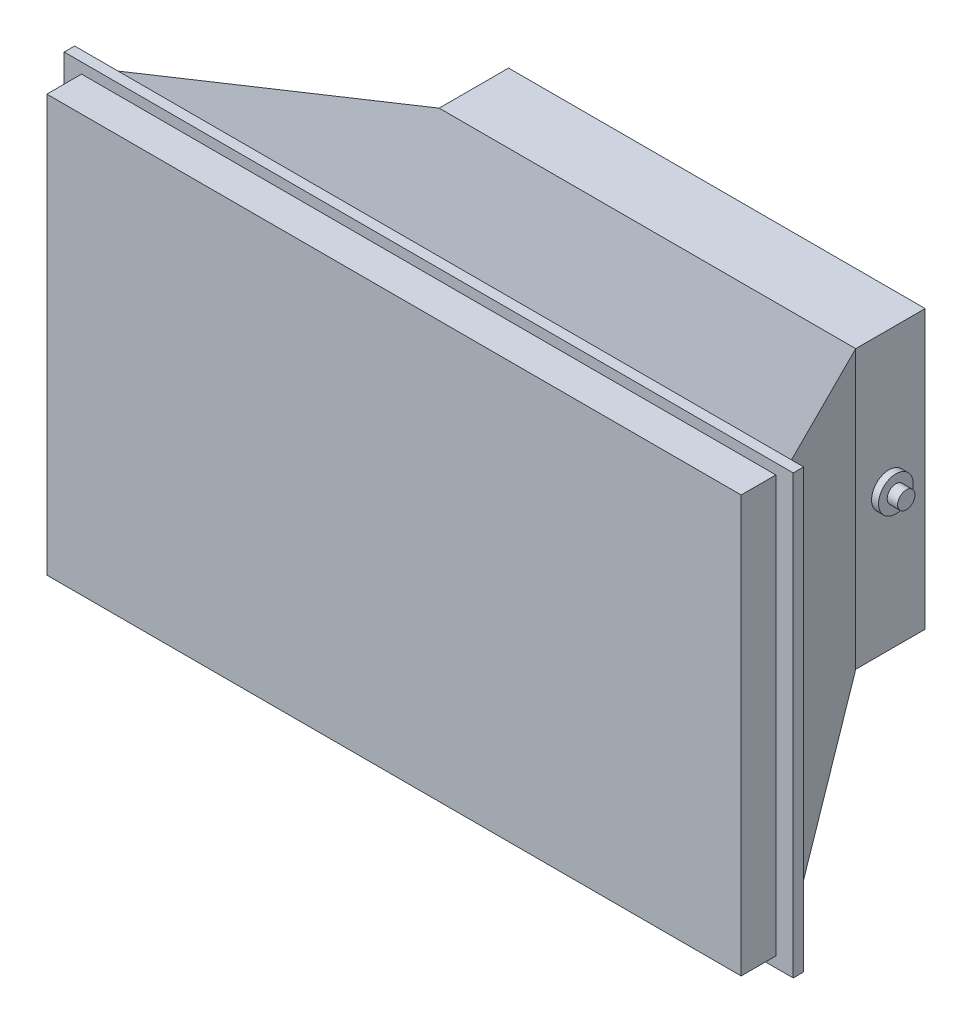
ISO-10303-21;
HEADER;
FILE_DESCRIPTION(('STEP AP214'),'2;1');
FILE_NAME('part.step','',(''),(''),'','','');
FILE_SCHEMA(('AUTOMOTIVE_DESIGN { 1 0 10303 214 1 1 1 1 }'));
ENDSEC;
DATA;
#1=APPLICATION_CONTEXT('core data for automotive mechanical design processes');
#2=APPLICATION_PROTOCOL_DEFINITION('international standard','automotive_design',2000,#1);
#3=PRODUCT_CONTEXT('',#1,'mechanical');
#4=PRODUCT('Part','Part','',(#3));
#5=PRODUCT_RELATED_PRODUCT_CATEGORY('part','',(#4));
#6=PRODUCT_DEFINITION_FORMATION('','',#4);
#7=PRODUCT_DEFINITION_CONTEXT('part definition',#1,'design');
#8=PRODUCT_DEFINITION('design','',#6,#7);
#9=PRODUCT_DEFINITION_SHAPE('','',#8);
#10=(LENGTH_UNIT() NAMED_UNIT(*) SI_UNIT(.MILLI.,.METRE.));
#11=(NAMED_UNIT(*) PLANE_ANGLE_UNIT() SI_UNIT($,.RADIAN.));
#12=(NAMED_UNIT(*) SI_UNIT($,.STERADIAN.) SOLID_ANGLE_UNIT());
#13=UNCERTAINTY_MEASURE_WITH_UNIT(LENGTH_MEASURE(1.E-05),#10,'distance_accuracy_value','');
#14=(GEOMETRIC_REPRESENTATION_CONTEXT(3) GLOBAL_UNCERTAINTY_ASSIGNED_CONTEXT((#13)) GLOBAL_UNIT_ASSIGNED_CONTEXT((#10,
#11,#12)) REPRESENTATION_CONTEXT('',''));
#15=CARTESIAN_POINT('',(0.,0.,0.));
#16=DIRECTION('',(0.,0.,1.));
#17=DIRECTION('',(1.,0.,0.));
#18=AXIS2_PLACEMENT_3D('',#15,#16,#17);
#19=CARTESIAN_POINT('',(0.,0.,-13.));
#20=DIRECTION('',(0.,0.,-1.));
#21=DIRECTION('',(-1.,0.,0.));
#22=AXIS2_PLACEMENT_3D('',#19,#20,#21);
#23=PLANE('',#22);
#24=DIRECTION('',(0.,-1.,0.));
#25=VECTOR('',#24,1.);
#26=CARTESIAN_POINT('',(105.,63.,-13.));
#27=LINE('',#26,#25);
#28=CARTESIAN_POINT('',(105.,63.,-13.));
#29=VERTEX_POINT('',#28);
#30=CARTESIAN_POINT('',(105.,-63.,-13.));
#31=VERTEX_POINT('',#30);
#32=EDGE_CURVE('E331',#29,#31,#27,.T.);
#33=ORIENTED_EDGE('',*,*,#32,.T.);
#34=DIRECTION('',(-1.,0.,0.));
#35=VECTOR('',#34,1.);
#36=CARTESIAN_POINT('',(105.,-63.,-13.));
#37=LINE('',#36,#35);
#38=CARTESIAN_POINT('',(-105.,-63.,-13.));
#39=VERTEX_POINT('',#38);
#40=EDGE_CURVE('E346',#31,#39,#37,.T.);
#41=ORIENTED_EDGE('',*,*,#40,.T.);
#42=DIRECTION('',(0.,1.,0.));
#43=VECTOR('',#42,1.);
#44=CARTESIAN_POINT('',(-105.,63.,-13.));
#45=LINE('',#44,#43);
#46=CARTESIAN_POINT('',(-105.,63.,-13.));
#47=VERTEX_POINT('',#46);
#48=EDGE_CURVE('E343',#39,#47,#45,.T.);
#49=ORIENTED_EDGE('',*,*,#48,.T.);
#50=DIRECTION('',(1.,0.,0.));
#51=VECTOR('',#50,1.);
#52=CARTESIAN_POINT('',(105.,63.,-13.));
#53=LINE('',#52,#51);
#54=EDGE_CURVE('E327',#47,#29,#53,.T.);
#55=ORIENTED_EDGE('',*,*,#54,.T.);
#56=EDGE_LOOP('',(#33,#41,#49,#55));
#57=FACE_BOUND('',#56,.T.);
#58=DIRECTION('',(-1.,0.,0.));
#59=VECTOR('',#58,1.);
#60=CARTESIAN_POINT('',(100.,-60.,-13.));
#61=LINE('',#60,#59);
#62=CARTESIAN_POINT('',(100.,-60.,-13.));
#63=VERTEX_POINT('',#62);
#64=CARTESIAN_POINT('',(-100.,-60.,-13.));
#65=VERTEX_POINT('',#64);
#66=EDGE_CURVE('E124',#63,#65,#61,.T.);
#67=ORIENTED_EDGE('',*,*,#66,.F.);
#68=DIRECTION('',(0.,-1.,0.));
#69=VECTOR('',#68,1.);
#70=CARTESIAN_POINT('',(100.,60.,-13.));
#71=LINE('',#70,#69);
#72=CARTESIAN_POINT('',(100.,60.,-13.));
#73=VERTEX_POINT('',#72);
#74=EDGE_CURVE('E127',#73,#63,#71,.T.);
#75=ORIENTED_EDGE('',*,*,#74,.F.);
#76=DIRECTION('',(1.,0.,0.));
#77=VECTOR('',#76,1.);
#78=CARTESIAN_POINT('',(100.,60.,-13.));
#79=LINE('',#78,#77);
#80=CARTESIAN_POINT('',(-100.,60.,-13.));
#81=VERTEX_POINT('',#80);
#82=EDGE_CURVE('E130',#81,#73,#79,.T.);
#83=ORIENTED_EDGE('',*,*,#82,.F.);
#84=DIRECTION('',(0.,1.,0.));
#85=VECTOR('',#84,1.);
#86=CARTESIAN_POINT('',(-100.,60.,-13.));
#87=LINE('',#86,#85);
#88=EDGE_CURVE('E126',#65,#81,#87,.T.);
#89=ORIENTED_EDGE('',*,*,#88,.F.);
#90=EDGE_LOOP('',(#67,#75,#83,#89));
#91=FACE_BOUND('',#90,.T.);
#92=ADVANCED_FACE('F47',(#57,#91),#23,.T.);
#93=CARTESIAN_POINT('',(-100.,60.,-10.));
#94=DIRECTION('',(-1.,0.,0.));
#95=DIRECTION('',(0.,-1.,0.));
#96=AXIS2_PLACEMENT_3D('',#93,#94,#95);
#97=PLANE('',#96);
#98=DIRECTION('',(0.,-1.,0.));
#99=VECTOR('',#98,1.);
#100=CARTESIAN_POINT('',(-100.,60.,0.));
#101=LINE('',#100,#99);
#102=CARTESIAN_POINT('',(-100.,60.,0.));
#103=VERTEX_POINT('',#102);
#104=CARTESIAN_POINT('',(-100.,-60.,0.));
#105=VERTEX_POINT('',#104);
#106=EDGE_CURVE('E115',#103,#105,#101,.T.);
#107=ORIENTED_EDGE('',*,*,#106,.F.);
#108=DIRECTION('',(0.,0.,1.));
#109=VECTOR('',#108,1.);
#110=CARTESIAN_POINT('',(-100.,60.,-10.));
#111=LINE('',#110,#109);
#112=CARTESIAN_POINT('',(-100.,60.,-10.));
#113=VERTEX_POINT('',#112);
#114=EDGE_CURVE('E97',#113,#103,#111,.T.);
#115=ORIENTED_EDGE('',*,*,#114,.F.);
#116=DIRECTION('',(0.,-1.,0.));
#117=VECTOR('',#116,1.);
#118=CARTESIAN_POINT('',(-100.,60.,-10.));
#119=LINE('',#118,#117);
#120=CARTESIAN_POINT('',(-100.,-60.,-10.));
#121=VERTEX_POINT('',#120);
#122=EDGE_CURVE('E102',#113,#121,#119,.T.);
#123=ORIENTED_EDGE('',*,*,#122,.T.);
#124=DIRECTION('',(0.,0.,1.));
#125=VECTOR('',#124,1.);
#126=CARTESIAN_POINT('',(-100.,-60.,-10.));
#127=LINE('',#126,#125);
#128=EDGE_CURVE('E121',#121,#105,#127,.T.);
#129=ORIENTED_EDGE('',*,*,#128,.T.);
#130=EDGE_LOOP('',(#107,#115,#123,#129));
#131=FACE_BOUND('',#130,.T.);
#132=ADVANCED_FACE('F49',(#131),#97,.T.);
#133=CARTESIAN_POINT('',(-100.,60.,-10.));
#134=DIRECTION('',(0.,-1.,0.));
#135=DIRECTION('',(1.,0.,0.));
#136=AXIS2_PLACEMENT_3D('',#133,#134,#135);
#137=PLANE('',#136);
#138=DIRECTION('',(1.,0.,0.));
#139=VECTOR('',#138,1.);
#140=CARTESIAN_POINT('',(-100.,60.,0.));
#141=LINE('',#140,#139);
#142=CARTESIAN_POINT('',(100.,60.,0.));
#143=VERTEX_POINT('',#142);
#144=EDGE_CURVE('E90',#103,#143,#141,.T.);
#145=ORIENTED_EDGE('',*,*,#144,.T.);
#146=DIRECTION('',(0.,0.,1.));
#147=VECTOR('',#146,1.);
#148=CARTESIAN_POINT('',(100.,60.,-10.));
#149=LINE('',#148,#147);
#150=CARTESIAN_POINT('',(100.,60.,-10.));
#151=VERTEX_POINT('',#150);
#152=EDGE_CURVE('E95',#151,#143,#149,.T.);
#153=ORIENTED_EDGE('',*,*,#152,.F.);
#154=DIRECTION('',(1.,0.,0.));
#155=VECTOR('',#154,1.);
#156=CARTESIAN_POINT('',(-100.,60.,-10.));
#157=LINE('',#156,#155);
#158=EDGE_CURVE('E123',#113,#151,#157,.T.);
#159=ORIENTED_EDGE('',*,*,#158,.F.);
#160=ORIENTED_EDGE('',*,*,#114,.T.);
#161=EDGE_LOOP('',(#145,#153,#159,#160));
#162=FACE_BOUND('',#161,.T.);
#163=ADVANCED_FACE('F92',(#162),#137,.F.);
#164=CARTESIAN_POINT('',(100.,60.,-10.));
#165=DIRECTION('',(-1.,0.,0.));
#166=DIRECTION('',(0.,-1.,0.));
#167=AXIS2_PLACEMENT_3D('',#164,#165,#166);
#168=PLANE('',#167);
#169=DIRECTION('',(0.,-1.,0.));
#170=VECTOR('',#169,1.);
#171=CARTESIAN_POINT('',(100.,60.,0.));
#172=LINE('',#171,#170);
#173=CARTESIAN_POINT('',(100.,-60.,0.));
#174=VERTEX_POINT('',#173);
#175=EDGE_CURVE('E103',#143,#174,#172,.T.);
#176=ORIENTED_EDGE('',*,*,#175,.T.);
#177=DIRECTION('',(0.,0.,1.));
#178=VECTOR('',#177,1.);
#179=CARTESIAN_POINT('',(100.,-60.,-10.));
#180=LINE('',#179,#178);
#181=CARTESIAN_POINT('',(100.,-60.,-10.));
#182=VERTEX_POINT('',#181);
#183=EDGE_CURVE('E109',#182,#174,#180,.T.);
#184=ORIENTED_EDGE('',*,*,#183,.F.);
#185=DIRECTION('',(0.,-1.,0.));
#186=VECTOR('',#185,1.);
#187=CARTESIAN_POINT('',(100.,60.,-10.));
#188=LINE('',#187,#186);
#189=EDGE_CURVE('E72',#151,#182,#188,.T.);
#190=ORIENTED_EDGE('',*,*,#189,.F.);
#191=ORIENTED_EDGE('',*,*,#152,.T.);
#192=EDGE_LOOP('',(#176,#184,#190,#191));
#193=FACE_BOUND('',#192,.T.);
#194=ADVANCED_FACE('F107',(#193),#168,.F.);
#195=CARTESIAN_POINT('',(-100.,-60.,-10.));
#196=DIRECTION('',(0.,-1.,0.));
#197=DIRECTION('',(1.,0.,0.));
#198=AXIS2_PLACEMENT_3D('',#195,#196,#197);
#199=PLANE('',#198);
#200=DIRECTION('',(1.,0.,0.));
#201=VECTOR('',#200,1.);
#202=CARTESIAN_POINT('',(-100.,-60.,0.));
#203=LINE('',#202,#201);
#204=EDGE_CURVE('E113',#105,#174,#203,.T.);
#205=ORIENTED_EDGE('',*,*,#204,.F.);
#206=ORIENTED_EDGE('',*,*,#128,.F.);
#207=DIRECTION('',(1.,0.,0.));
#208=VECTOR('',#207,1.);
#209=CARTESIAN_POINT('',(-100.,-60.,-10.));
#210=LINE('',#209,#208);
#211=EDGE_CURVE('E316',#121,#182,#210,.T.);
#212=ORIENTED_EDGE('',*,*,#211,.T.);
#213=ORIENTED_EDGE('',*,*,#183,.T.);
#214=EDGE_LOOP('',(#205,#206,#212,#213));
#215=FACE_BOUND('',#214,.T.);
#216=ADVANCED_FACE('F296',(#215),#199,.T.);
#217=CARTESIAN_POINT('',(0.,0.,0.));
#218=DIRECTION('',(0.,0.,1.));
#219=DIRECTION('',(1.,0.,0.));
#220=AXIS2_PLACEMENT_3D('',#217,#218,#219);
#221=PLANE('',#220);
#222=ORIENTED_EDGE('',*,*,#106,.T.);
#223=ORIENTED_EDGE('',*,*,#204,.T.);
#224=ORIENTED_EDGE('',*,*,#175,.F.);
#225=ORIENTED_EDGE('',*,*,#144,.F.);
#226=EDGE_LOOP('',(#222,#223,#224,#225));
#227=FACE_BOUND('',#226,.T.);
#228=ADVANCED_FACE('F111',(#227),#221,.T.);
#229=CARTESIAN_POINT('',(105.,63.,-13.));
#230=DIRECTION('',(-1.,0.,0.));
#231=DIRECTION('',(0.,-1.,0.));
#232=AXIS2_PLACEMENT_3D('',#229,#230,#231);
#233=PLANE('',#232);
#234=DIRECTION('',(0.,-1.,0.));
#235=VECTOR('',#234,1.);
#236=CARTESIAN_POINT('',(105.,63.,-10.));
#237=LINE('',#236,#235);
#238=CARTESIAN_POINT('',(105.,63.,-10.));
#239=VERTEX_POINT('',#238);
#240=CARTESIAN_POINT('',(105.,-63.,-10.));
#241=VERTEX_POINT('',#240);
#242=EDGE_CURVE('E338',#239,#241,#237,.T.);
#243=ORIENTED_EDGE('',*,*,#242,.T.);
#244=DIRECTION('',(0.,0.,1.));
#245=VECTOR('',#244,1.);
#246=CARTESIAN_POINT('',(105.,-63.,-13.));
#247=LINE('',#246,#245);
#248=EDGE_CURVE('E309',#31,#241,#247,.T.);
#249=ORIENTED_EDGE('',*,*,#248,.F.);
#250=ORIENTED_EDGE('',*,*,#32,.F.);
#251=DIRECTION('',(0.,0.,1.));
#252=VECTOR('',#251,1.);
#253=CARTESIAN_POINT('',(105.,63.,-13.));
#254=LINE('',#253,#252);
#255=EDGE_CURVE('E324',#29,#239,#254,.T.);
#256=ORIENTED_EDGE('',*,*,#255,.T.);
#257=EDGE_LOOP('',(#243,#249,#250,#256));
#258=FACE_BOUND('',#257,.T.);
#259=ADVANCED_FACE('F289',(#258),#233,.F.);
#260=CARTESIAN_POINT('',(105.,-63.,-13.));
#261=DIRECTION('',(0.,1.,0.));
#262=DIRECTION('',(0.,0.,1.));
#263=AXIS2_PLACEMENT_3D('',#260,#261,#262);
#264=PLANE('',#263);
#265=DIRECTION('',(-1.,0.,0.));
#266=VECTOR('',#265,1.);
#267=CARTESIAN_POINT('',(105.,-63.,-10.));
#268=LINE('',#267,#266);
#269=CARTESIAN_POINT('',(-105.,-63.,-10.));
#270=VERTEX_POINT('',#269);
#271=EDGE_CURVE('E335',#241,#270,#268,.T.);
#272=ORIENTED_EDGE('',*,*,#271,.T.);
#273=DIRECTION('',(0.,0.,1.));
#274=VECTOR('',#273,1.);
#275=CARTESIAN_POINT('',(-105.,-63.,-13.));
#276=LINE('',#275,#274);
#277=EDGE_CURVE('E311',#39,#270,#276,.T.);
#278=ORIENTED_EDGE('',*,*,#277,.F.);
#279=ORIENTED_EDGE('',*,*,#40,.F.);
#280=ORIENTED_EDGE('',*,*,#248,.T.);
#281=EDGE_LOOP('',(#272,#278,#279,#280));
#282=FACE_BOUND('',#281,.T.);
#283=ADVANCED_FACE('F285',(#282),#264,.F.);
#284=CARTESIAN_POINT('',(-105.,63.,-13.));
#285=DIRECTION('',(1.,0.,0.));
#286=DIRECTION('',(0.,1.,0.));
#287=AXIS2_PLACEMENT_3D('',#284,#285,#286);
#288=PLANE('',#287);
#289=DIRECTION('',(0.,1.,0.));
#290=VECTOR('',#289,1.);
#291=CARTESIAN_POINT('',(-105.,63.,-10.));
#292=LINE('',#291,#290);
#293=CARTESIAN_POINT('',(-105.,63.,-10.));
#294=VERTEX_POINT('',#293);
#295=EDGE_CURVE('E332',#270,#294,#292,.T.);
#296=ORIENTED_EDGE('',*,*,#295,.T.);
#297=DIRECTION('',(0.,0.,1.));
#298=VECTOR('',#297,1.);
#299=CARTESIAN_POINT('',(-105.,63.,-13.));
#300=LINE('',#299,#298);
#301=EDGE_CURVE('E321',#47,#294,#300,.T.);
#302=ORIENTED_EDGE('',*,*,#301,.F.);
#303=ORIENTED_EDGE('',*,*,#48,.F.);
#304=ORIENTED_EDGE('',*,*,#277,.T.);
#305=EDGE_LOOP('',(#296,#302,#303,#304));
#306=FACE_BOUND('',#305,.T.);
#307=ADVANCED_FACE('F281',(#306),#288,.F.);
#308=CARTESIAN_POINT('',(105.,63.,-13.));
#309=DIRECTION('',(0.,-1.,0.));
#310=DIRECTION('',(0.,0.,-1.));
#311=AXIS2_PLACEMENT_3D('',#308,#309,#310);
#312=PLANE('',#311);
#313=DIRECTION('',(1.,0.,0.));
#314=VECTOR('',#313,1.);
#315=CARTESIAN_POINT('',(105.,63.,-10.));
#316=LINE('',#315,#314);
#317=EDGE_CURVE('E328',#294,#239,#316,.T.);
#318=ORIENTED_EDGE('',*,*,#317,.T.);
#319=ORIENTED_EDGE('',*,*,#255,.F.);
#320=ORIENTED_EDGE('',*,*,#54,.F.);
#321=ORIENTED_EDGE('',*,*,#301,.T.);
#322=EDGE_LOOP('',(#318,#319,#320,#321));
#323=FACE_BOUND('',#322,.T.);
#324=ADVANCED_FACE('F278',(#323),#312,.F.);
#325=CARTESIAN_POINT('',(0.,0.,-10.));
#326=DIRECTION('',(0.,0.,-1.));
#327=DIRECTION('',(-1.,0.,0.));
#328=AXIS2_PLACEMENT_3D('',#325,#326,#327);
#329=PLANE('',#328);
#330=ORIENTED_EDGE('',*,*,#122,.F.);
#331=ORIENTED_EDGE('',*,*,#158,.T.);
#332=ORIENTED_EDGE('',*,*,#189,.T.);
#333=ORIENTED_EDGE('',*,*,#211,.F.);
#334=EDGE_LOOP('',(#330,#331,#332,#333));
#335=FACE_BOUND('',#334,.T.);
#336=ORIENTED_EDGE('',*,*,#242,.F.);
#337=ORIENTED_EDGE('',*,*,#317,.F.);
#338=ORIENTED_EDGE('',*,*,#295,.F.);
#339=ORIENTED_EDGE('',*,*,#271,.F.);
#340=EDGE_LOOP('',(#336,#337,#338,#339));
#341=FACE_BOUND('',#340,.T.);
#342=ADVANCED_FACE('F238',(#335,#341),#329,.F.);
#343=CARTESIAN_POINT('',(75.2307692307692,0.,-50.1538461538462));
#344=DIRECTION('',(-0.832050294337843,0.,0.55470019622523));
#345=DIRECTION('',(0.55470019622523,0.,0.832050294337843));
#346=AXIS2_PLACEMENT_3D('',#343,#344,#345);
#347=PLANE('',#346);
#348=DIRECTION('',(-0.534522483824849,0.267261241912424,-0.801783725737273));
#349=VECTOR('',#348,1.);
#350=CARTESIAN_POINT('',(100.,-60.,-13.));
#351=LINE('',#350,#349);
#352=CARTESIAN_POINT('',(59.9999999999999,-40.,-73.));
#353=VERTEX_POINT('',#352);
#354=EDGE_CURVE('E63',#63,#353,#351,.T.);
#355=ORIENTED_EDGE('',*,*,#354,.T.);
#356=DIRECTION('',(0.,-1.,0.));
#357=VECTOR('',#356,1.);
#358=CARTESIAN_POINT('',(59.9999999999999,40.,-73.));
#359=LINE('',#358,#357);
#360=CARTESIAN_POINT('',(59.9999999999999,40.,-73.));
#361=VERTEX_POINT('',#360);
#362=EDGE_CURVE('E214',#361,#353,#359,.T.);
#363=ORIENTED_EDGE('',*,*,#362,.F.);
#364=DIRECTION('',(-0.534522483824849,-0.267261241912424,-0.801783725737273));
#365=VECTOR('',#364,1.);
#366=CARTESIAN_POINT('',(100.,60.,-13.));
#367=LINE('',#366,#365);
#368=EDGE_CURVE('E652',#73,#361,#367,.T.);
#369=ORIENTED_EDGE('',*,*,#368,.F.);
#370=ORIENTED_EDGE('',*,*,#74,.T.);
#371=EDGE_LOOP('',(#355,#363,#369,#370));
#372=FACE_BOUND('',#371,.T.);
#373=ADVANCED_FACE('F233',(#372),#347,.F.);
#374=CARTESIAN_POINT('',(0.,57.9,-19.3));
#375=DIRECTION('',(0.,-0.948683298050514,0.316227766016838));
#376=DIRECTION('',(0.,-0.316227766016838,-0.948683298050514));
#377=AXIS2_PLACEMENT_3D('',#374,#375,#376);
#378=PLANE('',#377);
#379=ORIENTED_EDGE('',*,*,#368,.T.);
#380=DIRECTION('',(1.,0.,0.));
#381=VECTOR('',#380,1.);
#382=CARTESIAN_POINT('',(59.9999999999999,40.,-73.));
#383=LINE('',#382,#381);
#384=CARTESIAN_POINT('',(-60.0000000000001,40.,-73.));
#385=VERTEX_POINT('',#384);
#386=EDGE_CURVE('E157',#385,#361,#383,.T.);
#387=ORIENTED_EDGE('',*,*,#386,.F.);
#388=DIRECTION('',(0.534522483824848,-0.267261241912424,-0.801783725737274));
#389=VECTOR('',#388,1.);
#390=CARTESIAN_POINT('',(-100.,60.,-13.));
#391=LINE('',#390,#389);
#392=EDGE_CURVE('E217',#81,#385,#391,.T.);
#393=ORIENTED_EDGE('',*,*,#392,.F.);
#394=ORIENTED_EDGE('',*,*,#82,.T.);
#395=EDGE_LOOP('',(#379,#387,#393,#394));
#396=FACE_BOUND('',#395,.T.);
#397=ADVANCED_FACE('F237',(#396),#378,.F.);
#398=CARTESIAN_POINT('',(0.,-57.9,-19.3));
#399=DIRECTION('',(0.,0.948683298050514,0.316227766016838));
#400=DIRECTION('',(0.,-0.316227766016838,0.948683298050514));
#401=AXIS2_PLACEMENT_3D('',#398,#399,#400);
#402=PLANE('',#401);
#403=DIRECTION('',(0.534522483824849,0.267261241912424,-0.801783725737273));
#404=VECTOR('',#403,1.);
#405=CARTESIAN_POINT('',(-100.,-60.,-13.));
#406=LINE('',#405,#404);
#407=CARTESIAN_POINT('',(-60.,-40.,-73.));
#408=VERTEX_POINT('',#407);
#409=EDGE_CURVE('E649',#65,#408,#406,.T.);
#410=ORIENTED_EDGE('',*,*,#409,.T.);
#411=DIRECTION('',(-1.,0.,0.));
#412=VECTOR('',#411,1.);
#413=CARTESIAN_POINT('',(59.9999999999999,-40.,-73.));
#414=LINE('',#413,#412);
#415=EDGE_CURVE('E199',#353,#408,#414,.T.);
#416=ORIENTED_EDGE('',*,*,#415,.F.);
#417=ORIENTED_EDGE('',*,*,#354,.F.);
#418=ORIENTED_EDGE('',*,*,#66,.T.);
#419=EDGE_LOOP('',(#410,#416,#417,#418));
#420=FACE_BOUND('',#419,.T.);
#421=ADVANCED_FACE('F261',(#420),#402,.F.);
#422=CARTESIAN_POINT('',(-75.2307692307693,0.,-50.1538461538461));
#423=DIRECTION('',(0.832050294337844,0.,0.554700196225228));
#424=DIRECTION('',(0.554700196225228,0.,-0.832050294337844));
#425=AXIS2_PLACEMENT_3D('',#422,#423,#424);
#426=PLANE('',#425);
#427=ORIENTED_EDGE('',*,*,#392,.T.);
#428=DIRECTION('',(0.,1.,0.));
#429=VECTOR('',#428,1.);
#430=CARTESIAN_POINT('',(-60.0000000000001,40.,-73.));
#431=LINE('',#430,#429);
#432=EDGE_CURVE('E191',#408,#385,#431,.T.);
#433=ORIENTED_EDGE('',*,*,#432,.F.);
#434=ORIENTED_EDGE('',*,*,#409,.F.);
#435=ORIENTED_EDGE('',*,*,#88,.T.);
#436=EDGE_LOOP('',(#427,#433,#434,#435));
#437=FACE_BOUND('',#436,.T.);
#438=ADVANCED_FACE('F231',(#437),#426,.F.);
#439=CARTESIAN_POINT('',(59.9999999999999,40.,-93.));
#440=DIRECTION('',(-1.,0.,0.));
#441=DIRECTION('',(0.,0.,1.));
#442=AXIS2_PLACEMENT_3D('',#439,#440,#441);
#443=PLANE('',#442);
#444=CARTESIAN_POINT('',(59.9999999999999,0.,-82.5680181586672));
#445=DIRECTION('',(-1.,0.,0.));
#446=DIRECTION('',(0.,0.,1.));
#447=AXIS2_PLACEMENT_3D('',#444,#445,#446);
#448=CIRCLE('',#447,5.);
#449=CARTESIAN_POINT('',(59.9999999999999,0.,-77.5680181586672));
#450=VERTEX_POINT('',#449);
#451=EDGE_CURVE('E51',#450,#450,#448,.F.);
#452=ORIENTED_EDGE('',*,*,#451,.F.);
#453=EDGE_LOOP('',(#452));
#454=FACE_BOUND('',#453,.T.);
#455=ORIENTED_EDGE('',*,*,#362,.T.);
#456=DIRECTION('',(0.,0.,1.));
#457=VECTOR('',#456,1.);
#458=CARTESIAN_POINT('',(59.9999999999999,-40.,-93.));
#459=LINE('',#458,#457);
#460=CARTESIAN_POINT('',(59.9999999999999,-40.,-93.));
#461=VERTEX_POINT('',#460);
#462=EDGE_CURVE('E136',#461,#353,#459,.T.);
#463=ORIENTED_EDGE('',*,*,#462,.F.);
#464=DIRECTION('',(0.,-1.,0.));
#465=VECTOR('',#464,1.);
#466=CARTESIAN_POINT('',(59.9999999999999,40.,-93.));
#467=LINE('',#466,#465);
#468=CARTESIAN_POINT('',(59.9999999999999,40.,-93.));
#469=VERTEX_POINT('',#468);
#470=EDGE_CURVE('E637',#469,#461,#467,.T.);
#471=ORIENTED_EDGE('',*,*,#470,.F.);
#472=DIRECTION('',(0.,0.,1.));
#473=VECTOR('',#472,1.);
#474=CARTESIAN_POINT('',(59.9999999999999,40.,-93.));
#475=LINE('',#474,#473);
#476=EDGE_CURVE('E143',#469,#361,#475,.T.);
#477=ORIENTED_EDGE('',*,*,#476,.T.);
#478=EDGE_LOOP('',(#455,#463,#471,#477));
#479=FACE_BOUND('',#478,.T.);
#480=ADVANCED_FACE('F222',(#454,#479),#443,.F.);
#481=CARTESIAN_POINT('',(59.9999999999999,-40.,-93.));
#482=DIRECTION('',(0.,1.,0.));
#483=DIRECTION('',(0.,0.,1.));
#484=AXIS2_PLACEMENT_3D('',#481,#482,#483);
#485=PLANE('',#484);
#486=ORIENTED_EDGE('',*,*,#415,.T.);
#487=DIRECTION('',(0.,0.,1.));
#488=VECTOR('',#487,1.);
#489=CARTESIAN_POINT('',(-60.,-40.,-93.));
#490=LINE('',#489,#488);
#491=CARTESIAN_POINT('',(-60.,-40.,-93.));
#492=VERTEX_POINT('',#491);
#493=EDGE_CURVE('E200',#492,#408,#490,.T.);
#494=ORIENTED_EDGE('',*,*,#493,.F.);
#495=DIRECTION('',(-1.,0.,0.));
#496=VECTOR('',#495,1.);
#497=CARTESIAN_POINT('',(59.9999999999999,-40.,-93.));
#498=LINE('',#497,#496);
#499=EDGE_CURVE('E640',#461,#492,#498,.T.);
#500=ORIENTED_EDGE('',*,*,#499,.F.);
#501=ORIENTED_EDGE('',*,*,#462,.T.);
#502=EDGE_LOOP('',(#486,#494,#500,#501));
#503=FACE_BOUND('',#502,.T.);
#504=ADVANCED_FACE('F180',(#503),#485,.F.);
#505=CARTESIAN_POINT('',(-60.,40.,-93.));
#506=DIRECTION('',(1.,0.,0.));
#507=DIRECTION('',(0.,0.,-1.));
#508=AXIS2_PLACEMENT_3D('',#505,#506,#507);
#509=PLANE('',#508);
#510=CARTESIAN_POINT('',(-59.9999999999999,0.,-82.5680181586672));
#511=DIRECTION('',(1.,0.,0.));
#512=DIRECTION('',(0.,0.,-1.));
#513=AXIS2_PLACEMENT_3D('',#510,#511,#512);
#514=CIRCLE('',#513,5.);
#515=CARTESIAN_POINT('',(-59.9999999999999,0.,-87.5680181586672));
#516=VERTEX_POINT('',#515);
#517=EDGE_CURVE('E620',#516,#516,#514,.T.);
#518=ORIENTED_EDGE('',*,*,#517,.T.);
#519=EDGE_LOOP('',(#518));
#520=FACE_BOUND('',#519,.T.);
#521=ORIENTED_EDGE('',*,*,#432,.T.);
#522=DIRECTION('',(0.,0.,1.));
#523=VECTOR('',#522,1.);
#524=CARTESIAN_POINT('',(-60.,40.,-93.));
#525=LINE('',#524,#523);
#526=CARTESIAN_POINT('',(-60.,40.,-93.));
#527=VERTEX_POINT('',#526);
#528=EDGE_CURVE('E146',#527,#385,#525,.T.);
#529=ORIENTED_EDGE('',*,*,#528,.F.);
#530=DIRECTION('',(0.,1.,0.));
#531=VECTOR('',#530,1.);
#532=CARTESIAN_POINT('',(-60.,40.,-93.));
#533=LINE('',#532,#531);
#534=EDGE_CURVE('E643',#492,#527,#533,.T.);
#535=ORIENTED_EDGE('',*,*,#534,.F.);
#536=ORIENTED_EDGE('',*,*,#493,.T.);
#537=EDGE_LOOP('',(#521,#529,#535,#536));
#538=FACE_BOUND('',#537,.T.);
#539=ADVANCED_FACE('F175',(#520,#538),#509,.F.);
#540=CARTESIAN_POINT('',(59.9999999999999,40.,-93.));
#541=DIRECTION('',(0.,-1.,0.));
#542=DIRECTION('',(0.,0.,-1.));
#543=AXIS2_PLACEMENT_3D('',#540,#541,#542);
#544=PLANE('',#543);
#545=ORIENTED_EDGE('',*,*,#386,.T.);
#546=ORIENTED_EDGE('',*,*,#476,.F.);
#547=DIRECTION('',(1.,0.,0.));
#548=VECTOR('',#547,1.);
#549=CARTESIAN_POINT('',(59.9999999999999,40.,-93.));
#550=LINE('',#549,#548);
#551=EDGE_CURVE('E147',#527,#469,#550,.T.);
#552=ORIENTED_EDGE('',*,*,#551,.F.);
#553=ORIENTED_EDGE('',*,*,#528,.T.);
#554=EDGE_LOOP('',(#545,#546,#552,#553));
#555=FACE_BOUND('',#554,.T.);
#556=ADVANCED_FACE('F164',(#555),#544,.F.);
#557=CARTESIAN_POINT('',(0.,0.,-93.));
#558=DIRECTION('',(0.,0.,-1.));
#559=DIRECTION('',(-1.,0.,0.));
#560=AXIS2_PLACEMENT_3D('',#557,#558,#559);
#561=PLANE('',#560);
#562=ORIENTED_EDGE('',*,*,#470,.T.);
#563=ORIENTED_EDGE('',*,*,#499,.T.);
#564=ORIENTED_EDGE('',*,*,#534,.T.);
#565=ORIENTED_EDGE('',*,*,#551,.T.);
#566=EDGE_LOOP('',(#562,#563,#564,#565));
#567=FACE_BOUND('',#566,.T.);
#568=ADVANCED_FACE('F174',(#567),#561,.T.);
#569=CARTESIAN_POINT('',(61.9999999999999,0.,-82.5680181586672));
#570=DIRECTION('',(-1.,0.,0.));
#571=DIRECTION('',(0.,0.,1.));
#572=AXIS2_PLACEMENT_3D('',#569,#570,#571);
#573=CYLINDRICAL_SURFACE('',#572,5.);
#574=CARTESIAN_POINT('',(61.9999999999999,0.,-82.5680181586672));
#575=DIRECTION('',(1.,0.,0.));
#576=DIRECTION('',(0.,0.,-1.));
#577=AXIS2_PLACEMENT_3D('',#574,#575,#576);
#578=CIRCLE('',#577,5.);
#579=CARTESIAN_POINT('',(61.9999999999999,0.,-87.5680181586672));
#580=VERTEX_POINT('',#579);
#581=EDGE_CURVE('E633',#580,#580,#578,.T.);
#582=ORIENTED_EDGE('',*,*,#581,.F.);
#583=EDGE_LOOP('',(#582));
#584=FACE_BOUND('',#583,.T.);
#585=ORIENTED_EDGE('',*,*,#451,.T.);
#586=EDGE_LOOP('',(#585));
#587=FACE_BOUND('',#586,.T.);
#588=ADVANCED_FACE('F497',(#584,#587),#573,.T.);
#589=CARTESIAN_POINT('',(61.9999999999999,0.,-82.5680181586672));
#590=DIRECTION('',(1.,0.,0.));
#591=DIRECTION('',(0.,0.,-1.));
#592=AXIS2_PLACEMENT_3D('',#589,#590,#591);
#593=PLANE('',#592);
#594=CARTESIAN_POINT('',(61.9999999999999,0.,-82.5680181586672));
#595=DIRECTION('',(1.,0.,0.));
#596=DIRECTION('',(0.,0.,-1.));
#597=AXIS2_PLACEMENT_3D('',#594,#595,#596);
#598=CIRCLE('',#597,2.5);
#599=CARTESIAN_POINT('',(61.9999999999999,0.,-85.0680181586672));
#600=VERTEX_POINT('',#599);
#601=EDGE_CURVE('E12',#600,#600,#598,.T.);
#602=ORIENTED_EDGE('',*,*,#601,.F.);
#603=EDGE_LOOP('',(#602));
#604=FACE_BOUND('',#603,.T.);
#605=ORIENTED_EDGE('',*,*,#581,.T.);
#606=EDGE_LOOP('',(#605));
#607=FACE_BOUND('',#606,.T.);
#608=ADVANCED_FACE('F513',(#604,#607),#593,.T.);
#609=CARTESIAN_POINT('',(64.9999999999999,0.,-82.5680181586672));
#610=DIRECTION('',(-1.,0.,0.));
#611=DIRECTION('',(0.,0.,1.));
#612=AXIS2_PLACEMENT_3D('',#609,#610,#611);
#613=CYLINDRICAL_SURFACE('',#612,2.5);
#614=CARTESIAN_POINT('',(64.9999999999999,0.,-82.5680181586672));
#615=DIRECTION('',(1.,0.,0.));
#616=DIRECTION('',(0.,0.,-1.));
#617=AXIS2_PLACEMENT_3D('',#614,#615,#616);
#618=CIRCLE('',#617,2.5);
#619=CARTESIAN_POINT('',(64.9999999999999,0.,-85.0680181586672));
#620=VERTEX_POINT('',#619);
#621=EDGE_CURVE('E630',#620,#620,#618,.T.);
#622=ORIENTED_EDGE('',*,*,#621,.F.);
#623=EDGE_LOOP('',(#622));
#624=FACE_BOUND('',#623,.T.);
#625=ORIENTED_EDGE('',*,*,#601,.T.);
#626=EDGE_LOOP('',(#625));
#627=FACE_BOUND('',#626,.T.);
#628=ADVANCED_FACE('F523',(#624,#627),#613,.T.);
#629=CARTESIAN_POINT('',(64.9999999999999,0.,-82.5680181586672));
#630=DIRECTION('',(1.,0.,0.));
#631=DIRECTION('',(0.,0.,-1.));
#632=AXIS2_PLACEMENT_3D('',#629,#630,#631);
#633=PLANE('',#632);
#634=ORIENTED_EDGE('',*,*,#621,.T.);
#635=EDGE_LOOP('',(#634));
#636=FACE_BOUND('',#635,.T.);
#637=ADVANCED_FACE('F534',(#636),#633,.T.);
#638=CARTESIAN_POINT('',(-61.9999999999999,0.,-82.5680181586672));
#639=DIRECTION('',(1.,0.,0.));
#640=DIRECTION('',(0.,0.,-1.));
#641=AXIS2_PLACEMENT_3D('',#638,#639,#640);
#642=CYLINDRICAL_SURFACE('',#641,5.);
#643=CARTESIAN_POINT('',(-61.9999999999999,0.,-82.5680181586672));
#644=DIRECTION('',(1.,0.,0.));
#645=DIRECTION('',(0.,0.,-1.));
#646=AXIS2_PLACEMENT_3D('',#643,#644,#645);
#647=CIRCLE('',#646,5.);
#648=CARTESIAN_POINT('',(-61.9999999999999,0.,-87.5680181586672));
#649=VERTEX_POINT('',#648);
#650=EDGE_CURVE('E624',#649,#649,#647,.T.);
#651=ORIENTED_EDGE('',*,*,#650,.T.);
#652=EDGE_LOOP('',(#651));
#653=FACE_BOUND('',#652,.T.);
#654=ORIENTED_EDGE('',*,*,#517,.F.);
#655=EDGE_LOOP('',(#654));
#656=FACE_BOUND('',#655,.T.);
#657=ADVANCED_FACE('F545',(#653,#656),#642,.T.);
#658=CARTESIAN_POINT('',(-61.9999999999999,0.,-82.5680181586672));
#659=DIRECTION('',(-1.,0.,0.));
#660=DIRECTION('',(0.,0.,-1.));
#661=AXIS2_PLACEMENT_3D('',#658,#659,#660);
#662=PLANE('',#661);
#663=CARTESIAN_POINT('',(-61.9999999999999,0.,-82.5680181586672));
#664=DIRECTION('',(1.,0.,0.));
#665=DIRECTION('',(0.,0.,-1.));
#666=AXIS2_PLACEMENT_3D('',#663,#664,#665);
#667=CIRCLE('',#666,2.5);
#668=CARTESIAN_POINT('',(-61.9999999999999,0.,-85.0680181586672));
#669=VERTEX_POINT('',#668);
#670=EDGE_CURVE('E621',#669,#669,#667,.T.);
#671=ORIENTED_EDGE('',*,*,#670,.T.);
#672=EDGE_LOOP('',(#671));
#673=FACE_BOUND('',#672,.T.);
#674=ORIENTED_EDGE('',*,*,#650,.F.);
#675=EDGE_LOOP('',(#674));
#676=FACE_BOUND('',#675,.T.);
#677=ADVANCED_FACE('F562',(#673,#676),#662,.T.);
#678=CARTESIAN_POINT('',(-64.9999999999999,0.,-82.5680181586672));
#679=DIRECTION('',(1.,0.,0.));
#680=DIRECTION('',(0.,0.,-1.));
#681=AXIS2_PLACEMENT_3D('',#678,#679,#680);
#682=CYLINDRICAL_SURFACE('',#681,2.5);
#683=CARTESIAN_POINT('',(-64.9999999999999,0.,-82.5680181586672));
#684=DIRECTION('',(1.,0.,0.));
#685=DIRECTION('',(0.,0.,-1.));
#686=AXIS2_PLACEMENT_3D('',#683,#684,#685);
#687=CIRCLE('',#686,2.5);
#688=CARTESIAN_POINT('',(-64.9999999999999,0.,-85.0680181586672));
#689=VERTEX_POINT('',#688);
#690=EDGE_CURVE('E619',#689,#689,#687,.T.);
#691=ORIENTED_EDGE('',*,*,#690,.T.);
#692=EDGE_LOOP('',(#691));
#693=FACE_BOUND('',#692,.T.);
#694=ORIENTED_EDGE('',*,*,#670,.F.);
#695=EDGE_LOOP('',(#694));
#696=FACE_BOUND('',#695,.T.);
#697=ADVANCED_FACE('F573',(#693,#696),#682,.T.);
#698=CARTESIAN_POINT('',(-64.9999999999999,0.,-82.5680181586672));
#699=DIRECTION('',(-1.,0.,0.));
#700=DIRECTION('',(0.,0.,-1.));
#701=AXIS2_PLACEMENT_3D('',#698,#699,#700);
#702=PLANE('',#701);
#703=ORIENTED_EDGE('',*,*,#690,.F.);
#704=EDGE_LOOP('',(#703));
#705=FACE_BOUND('',#704,.T.);
#706=ADVANCED_FACE('F584',(#705),#702,.T.);
#707=CLOSED_SHELL('',(#92,#132,#163,#194,#216,#228,#259,#283,#307,#324,#342,#373,#397,#421,#438,
#480,#504,#539,#556,#568,#588,#608,#628,#637,#657,#677,#697,#706));
#708=MANIFOLD_SOLID_BREP('B2',#707);
#709=ADVANCED_BREP_SHAPE_REPRESENTATION('',(#18,#708),#14);
#710=SHAPE_DEFINITION_REPRESENTATION(#9,#709);
ENDSEC;
END-ISO-10303-21;
